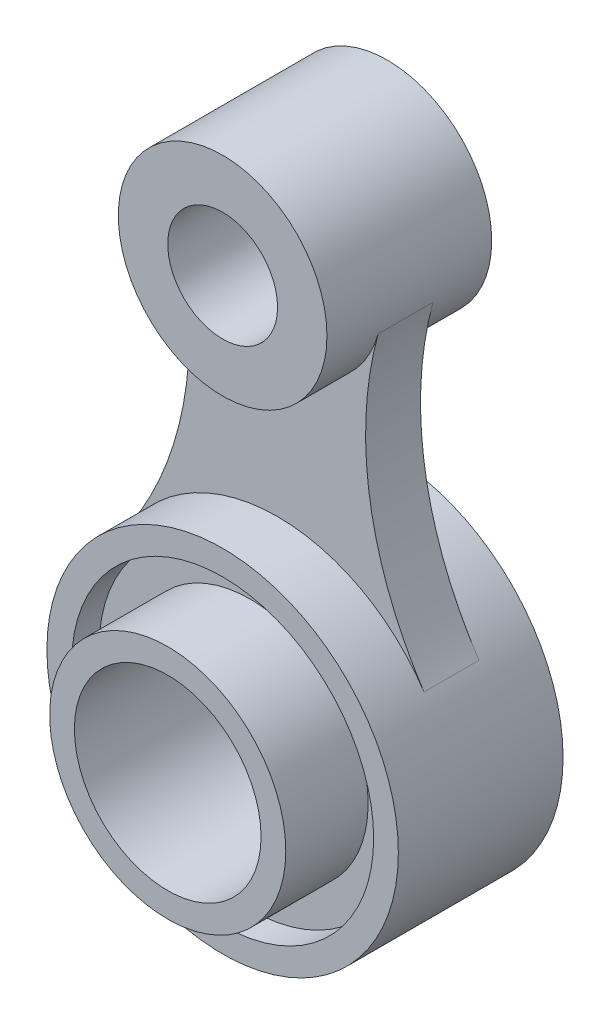
ISO-10303-21;
HEADER;
FILE_DESCRIPTION(('STEP AP214'),'2;1');
FILE_NAME('part.step','',(''),(''),'','','');
FILE_SCHEMA(('AUTOMOTIVE_DESIGN { 1 0 10303 214 1 1 1 1 }'));
ENDSEC;
DATA;
#1=APPLICATION_CONTEXT('core data for automotive mechanical design processes');
#2=APPLICATION_PROTOCOL_DEFINITION('international standard','automotive_design',2000,#1);
#3=PRODUCT_CONTEXT('',#1,'mechanical');
#4=PRODUCT('Part','Part','',(#3));
#5=PRODUCT_RELATED_PRODUCT_CATEGORY('part','',(#4));
#6=PRODUCT_DEFINITION_FORMATION('','',#4);
#7=PRODUCT_DEFINITION_CONTEXT('part definition',#1,'design');
#8=PRODUCT_DEFINITION('design','',#6,#7);
#9=PRODUCT_DEFINITION_SHAPE('','',#8);
#10=(LENGTH_UNIT() NAMED_UNIT(*) SI_UNIT(.MILLI.,.METRE.));
#11=(NAMED_UNIT(*) PLANE_ANGLE_UNIT() SI_UNIT($,.RADIAN.));
#12=(NAMED_UNIT(*) SI_UNIT($,.STERADIAN.) SOLID_ANGLE_UNIT());
#13=UNCERTAINTY_MEASURE_WITH_UNIT(LENGTH_MEASURE(1.E-05),#10,'distance_accuracy_value','');
#14=(GEOMETRIC_REPRESENTATION_CONTEXT(3) GLOBAL_UNCERTAINTY_ASSIGNED_CONTEXT((#13)) GLOBAL_UNIT_ASSIGNED_CONTEXT((#10,
#11,#12)) REPRESENTATION_CONTEXT('',''));
#15=CARTESIAN_POINT('',(0.,0.,0.));
#16=DIRECTION('',(0.,0.,1.));
#17=DIRECTION('',(1.,0.,0.));
#18=AXIS2_PLACEMENT_3D('',#15,#16,#17);
#19=CARTESIAN_POINT('',(0.,0.,30.));
#20=DIRECTION('',(0.,0.,-1.));
#21=DIRECTION('',(-1.,0.,0.));
#22=AXIS2_PLACEMENT_3D('',#19,#20,#21);
#23=CYLINDRICAL_SURFACE('',#22,32.);
#24=CARTESIAN_POINT('',(0.,0.,0.));
#25=DIRECTION('',(0.,0.,1.));
#26=DIRECTION('',(1.,0.,0.));
#27=AXIS2_PLACEMENT_3D('',#24,#25,#26);
#28=CIRCLE('',#27,32.);
#29=CARTESIAN_POINT('',(32.,0.,0.));
#30=VERTEX_POINT('',#29);
#31=EDGE_CURVE('E136',#30,#30,#28,.T.);
#32=ORIENTED_EDGE('',*,*,#31,.T.);
#33=EDGE_LOOP('',(#32));
#34=FACE_BOUND('',#33,.T.);
#35=CARTESIAN_POINT('',(0.,0.,30.));
#36=DIRECTION('',(0.,0.,1.));
#37=DIRECTION('',(1.,0.,0.));
#38=AXIS2_PLACEMENT_3D('',#35,#36,#37);
#39=CIRCLE('',#38,32.);
#40=CARTESIAN_POINT('',(32.,0.,30.));
#41=VERTEX_POINT('',#40);
#42=EDGE_CURVE('E49',#41,#41,#39,.T.);
#43=ORIENTED_EDGE('',*,*,#42,.F.);
#44=EDGE_LOOP('',(#43));
#45=FACE_BOUND('',#44,.T.);
#46=CARTESIAN_POINT('',(0.,0.,10.));
#47=DIRECTION('',(0.,0.,-1.));
#48=DIRECTION('',(1.,0.,0.));
#49=AXIS2_PLACEMENT_3D('',#46,#47,#48);
#50=CIRCLE('',#49,32.);
#51=CARTESIAN_POINT('',(-26.6783026465097,17.6711111111111,10.));
#52=VERTEX_POINT('',#51);
#53=CARTESIAN_POINT('',(26.6783026465097,17.6711111111111,10.));
#54=VERTEX_POINT('',#53);
#55=EDGE_CURVE('E64',#52,#54,#50,.T.);
#56=ORIENTED_EDGE('',*,*,#55,.T.);
#57=DIRECTION('',(0.,0.,1.));
#58=VECTOR('',#57,1.);
#59=CARTESIAN_POINT('',(26.6783026465097,17.6711111111111,10.));
#60=LINE('',#59,#58);
#61=CARTESIAN_POINT('',(26.6783026465097,17.6711111111111,20.));
#62=VERTEX_POINT('',#61);
#63=EDGE_CURVE('E100',#54,#62,#60,.T.);
#64=ORIENTED_EDGE('',*,*,#63,.T.);
#65=CARTESIAN_POINT('',(0.,0.,20.));
#66=DIRECTION('',(0.,0.,-1.));
#67=DIRECTION('',(1.,0.,0.));
#68=AXIS2_PLACEMENT_3D('',#65,#66,#67);
#69=CIRCLE('',#68,32.);
#70=CARTESIAN_POINT('',(-26.6783026465097,17.6711111111111,20.));
#71=VERTEX_POINT('',#70);
#72=EDGE_CURVE('E104',#71,#62,#69,.T.);
#73=ORIENTED_EDGE('',*,*,#72,.F.);
#74=DIRECTION('',(0.,0.,1.));
#75=VECTOR('',#74,1.);
#76=CARTESIAN_POINT('',(-26.6783026465097,17.6711111111111,10.));
#77=LINE('',#76,#75);
#78=EDGE_CURVE('E125',#52,#71,#77,.T.);
#79=ORIENTED_EDGE('',*,*,#78,.F.);
#80=EDGE_LOOP('',(#56,#64,#73,#79));
#81=FACE_BOUND('',#80,.T.);
#82=ADVANCED_FACE('F41',(#34,#45,#81),#23,.T.);
#83=CARTESIAN_POINT('',(0.,0.,30.));
#84=DIRECTION('',(0.,0.,1.));
#85=DIRECTION('',(1.,0.,0.));
#86=AXIS2_PLACEMENT_3D('',#83,#84,#85);
#87=PLANE('',#86);
#88=ORIENTED_EDGE('',*,*,#42,.T.);
#89=EDGE_LOOP('',(#88));
#90=FACE_BOUND('',#89,.T.);
#91=CARTESIAN_POINT('',(0.,0.,30.));
#92=DIRECTION('',(0.,0.,1.));
#93=DIRECTION('',(1.,0.,0.));
#94=AXIS2_PLACEMENT_3D('',#91,#92,#93);
#95=CIRCLE('',#94,27.5);
#96=CARTESIAN_POINT('',(27.5,0.,30.));
#97=VERTEX_POINT('',#96);
#98=EDGE_CURVE('E128',#97,#97,#95,.T.);
#99=ORIENTED_EDGE('',*,*,#98,.F.);
#100=EDGE_LOOP('',(#99));
#101=FACE_BOUND('',#100,.T.);
#102=ADVANCED_FACE('F148',(#90,#101),#87,.T.);
#103=CARTESIAN_POINT('',(0.,0.,0.));
#104=DIRECTION('',(0.,0.,1.));
#105=DIRECTION('',(1.,0.,0.));
#106=AXIS2_PLACEMENT_3D('',#103,#104,#105);
#107=PLANE('',#106);
#108=CARTESIAN_POINT('',(0.,0.,0.));
#109=DIRECTION('',(0.,0.,1.));
#110=DIRECTION('',(1.,0.,0.));
#111=AXIS2_PLACEMENT_3D('',#108,#109,#110);
#112=CIRCLE('',#111,17.);
#113=CARTESIAN_POINT('',(17.,0.,0.));
#114=VERTEX_POINT('',#113);
#115=EDGE_CURVE('E347',#114,#114,#112,.F.);
#116=ORIENTED_EDGE('',*,*,#115,.F.);
#117=EDGE_LOOP('',(#116));
#118=FACE_BOUND('',#117,.T.);
#119=ORIENTED_EDGE('',*,*,#31,.F.);
#120=EDGE_LOOP('',(#119));
#121=FACE_BOUND('',#120,.T.);
#122=ADVANCED_FACE('F145',(#118,#121),#107,.F.);
#123=CARTESIAN_POINT('',(0.,0.,30.));
#124=DIRECTION('',(0.,0.,-1.));
#125=DIRECTION('',(-1.,0.,0.));
#126=AXIS2_PLACEMENT_3D('',#123,#124,#125);
#127=CYLINDRICAL_SURFACE('',#126,27.5);
#128=CARTESIAN_POINT('',(0.,0.,25.));
#129=DIRECTION('',(0.,0.,1.));
#130=DIRECTION('',(1.,0.,0.));
#131=AXIS2_PLACEMENT_3D('',#128,#129,#130);
#132=CIRCLE('',#131,27.5);
#133=CARTESIAN_POINT('',(27.5,0.,25.));
#134=VERTEX_POINT('',#133);
#135=EDGE_CURVE('E11',#134,#134,#132,.T.);
#136=ORIENTED_EDGE('',*,*,#135,.F.);
#137=EDGE_LOOP('',(#136));
#138=FACE_BOUND('',#137,.T.);
#139=ORIENTED_EDGE('',*,*,#98,.T.);
#140=EDGE_LOOP('',(#139));
#141=FACE_BOUND('',#140,.T.);
#142=ADVANCED_FACE('F147',(#138,#141),#127,.F.);
#143=CARTESIAN_POINT('',(-80.034907939529,53.0133333333333,10.));
#144=DIRECTION('',(0.,0.,1.));
#145=DIRECTION('',(1.,0.,0.));
#146=AXIS2_PLACEMENT_3D('',#143,#144,#145);
#147=CYLINDRICAL_SURFACE('',#146,64.);
#148=ORIENTED_EDGE('',*,*,#78,.T.);
#149=CARTESIAN_POINT('',(-80.034907939529,53.0133333333333,20.));
#150=DIRECTION('',(0.,0.,-1.));
#151=DIRECTION('',(1.,0.,0.));
#152=AXIS2_PLACEMENT_3D('',#149,#150,#151);
#153=CIRCLE('',#152,64.);
#154=CARTESIAN_POINT('',(-18.3212439861573,69.9669076305221,20.));
#155=VERTEX_POINT('',#154);
#156=EDGE_CURVE('E56',#155,#71,#153,.T.);
#157=ORIENTED_EDGE('',*,*,#156,.F.);
#158=DIRECTION('',(0.,0.,1.));
#159=VECTOR('',#158,1.);
#160=CARTESIAN_POINT('',(-18.3212439861573,69.9669076305221,10.));
#161=LINE('',#160,#159);
#162=CARTESIAN_POINT('',(-18.3212439861572,69.9669076305221,10.));
#163=VERTEX_POINT('',#162);
#164=EDGE_CURVE('E90',#163,#155,#161,.T.);
#165=ORIENTED_EDGE('',*,*,#164,.F.);
#166=CARTESIAN_POINT('',(-80.034907939529,53.0133333333333,10.));
#167=DIRECTION('',(0.,0.,-1.));
#168=DIRECTION('',(1.,0.,0.));
#169=AXIS2_PLACEMENT_3D('',#166,#167,#168);
#170=CIRCLE('',#169,64.);
#171=EDGE_CURVE('E122',#163,#52,#170,.T.);
#172=ORIENTED_EDGE('',*,*,#171,.T.);
#173=EDGE_LOOP('',(#148,#157,#165,#172));
#174=FACE_BOUND('',#173,.T.);
#175=ADVANCED_FACE('F154',(#174),#147,.F.);
#176=CARTESIAN_POINT('',(80.034907939529,53.0133333333333,10.));
#177=DIRECTION('',(0.,0.,1.));
#178=DIRECTION('',(1.,0.,0.));
#179=AXIS2_PLACEMENT_3D('',#176,#177,#178);
#180=CYLINDRICAL_SURFACE('',#179,64.);
#181=DIRECTION('',(0.,0.,1.));
#182=VECTOR('',#181,1.);
#183=CARTESIAN_POINT('',(18.3212439861572,69.9669076305221,10.));
#184=LINE('',#183,#182);
#185=CARTESIAN_POINT('',(18.3212439861572,69.9669076305221,10.));
#186=VERTEX_POINT('',#185);
#187=CARTESIAN_POINT('',(18.3212439861572,69.9669076305221,20.));
#188=VERTEX_POINT('',#187);
#189=EDGE_CURVE('E87',#186,#188,#184,.T.);
#190=ORIENTED_EDGE('',*,*,#189,.T.);
#191=CARTESIAN_POINT('',(80.034907939529,53.0133333333333,20.));
#192=DIRECTION('',(0.,0.,-1.));
#193=DIRECTION('',(-1.,0.,0.));
#194=AXIS2_PLACEMENT_3D('',#191,#192,#193);
#195=CIRCLE('',#194,64.);
#196=EDGE_CURVE('E93',#62,#188,#195,.T.);
#197=ORIENTED_EDGE('',*,*,#196,.F.);
#198=ORIENTED_EDGE('',*,*,#63,.F.);
#199=CARTESIAN_POINT('',(80.034907939529,53.0133333333333,10.));
#200=DIRECTION('',(0.,0.,-1.));
#201=DIRECTION('',(-1.,0.,0.));
#202=AXIS2_PLACEMENT_3D('',#199,#200,#201);
#203=CIRCLE('',#202,64.);
#204=EDGE_CURVE('E98',#54,#186,#203,.T.);
#205=ORIENTED_EDGE('',*,*,#204,.T.);
#206=EDGE_LOOP('',(#190,#197,#198,#205));
#207=FACE_BOUND('',#206,.T.);
#208=ADVANCED_FACE('F97',(#207),#180,.F.);
#209=CARTESIAN_POINT('',(-40.0174539697645,26.5066666666667,10.));
#210=DIRECTION('',(0.,0.,1.));
#211=DIRECTION('',(1.,0.,0.));
#212=AXIS2_PLACEMENT_3D('',#209,#210,#211);
#213=PLANE('',#212);
#214=ORIENTED_EDGE('',*,*,#55,.F.);
#215=ORIENTED_EDGE('',*,*,#171,.F.);
#216=CARTESIAN_POINT('',(0.,75.,10.));
#217=DIRECTION('',(0.,0.,-1.));
#218=DIRECTION('',(1.,0.,0.));
#219=AXIS2_PLACEMENT_3D('',#216,#217,#218);
#220=CIRCLE('',#219,19.);
#221=EDGE_CURVE('E119',#186,#163,#220,.T.);
#222=ORIENTED_EDGE('',*,*,#221,.F.);
#223=ORIENTED_EDGE('',*,*,#204,.F.);
#224=EDGE_LOOP('',(#214,#215,#222,#223));
#225=FACE_BOUND('',#224,.T.);
#226=ADVANCED_FACE('F288',(#225),#213,.F.);
#227=CARTESIAN_POINT('',(-40.0174539697645,26.5066666666667,20.));
#228=DIRECTION('',(0.,0.,1.));
#229=DIRECTION('',(1.,0.,0.));
#230=AXIS2_PLACEMENT_3D('',#227,#228,#229);
#231=PLANE('',#230);
#232=ORIENTED_EDGE('',*,*,#72,.T.);
#233=ORIENTED_EDGE('',*,*,#196,.T.);
#234=CARTESIAN_POINT('',(0.,75.,20.));
#235=DIRECTION('',(0.,0.,-1.));
#236=DIRECTION('',(1.,0.,0.));
#237=AXIS2_PLACEMENT_3D('',#234,#235,#236);
#238=CIRCLE('',#237,19.);
#239=EDGE_CURVE('E84',#188,#155,#238,.T.);
#240=ORIENTED_EDGE('',*,*,#239,.T.);
#241=ORIENTED_EDGE('',*,*,#156,.T.);
#242=EDGE_LOOP('',(#232,#233,#240,#241));
#243=FACE_BOUND('',#242,.T.);
#244=ADVANCED_FACE('F102',(#243),#231,.T.);
#245=CARTESIAN_POINT('',(0.,75.,0.));
#246=DIRECTION('',(0.,0.,1.));
#247=DIRECTION('',(1.,0.,0.));
#248=AXIS2_PLACEMENT_3D('',#245,#246,#247);
#249=CYLINDRICAL_SURFACE('',#248,19.);
#250=CARTESIAN_POINT('',(0.,75.,30.));
#251=DIRECTION('',(0.,0.,1.));
#252=DIRECTION('',(1.,0.,0.));
#253=AXIS2_PLACEMENT_3D('',#250,#251,#252);
#254=CIRCLE('',#253,19.);
#255=CARTESIAN_POINT('',(19.,75.,30.));
#256=VERTEX_POINT('',#255);
#257=EDGE_CURVE('E332',#256,#256,#254,.T.);
#258=ORIENTED_EDGE('',*,*,#257,.F.);
#259=EDGE_LOOP('',(#258));
#260=FACE_BOUND('',#259,.T.);
#261=CARTESIAN_POINT('',(0.,75.,0.));
#262=DIRECTION('',(0.,0.,1.));
#263=DIRECTION('',(1.,0.,0.));
#264=AXIS2_PLACEMENT_3D('',#261,#262,#263);
#265=CIRCLE('',#264,19.);
#266=CARTESIAN_POINT('',(19.,75.,0.));
#267=VERTEX_POINT('',#266);
#268=EDGE_CURVE('E109',#267,#267,#265,.T.);
#269=ORIENTED_EDGE('',*,*,#268,.T.);
#270=EDGE_LOOP('',(#269));
#271=FACE_BOUND('',#270,.T.);
#272=ORIENTED_EDGE('',*,*,#221,.T.);
#273=ORIENTED_EDGE('',*,*,#164,.T.);
#274=ORIENTED_EDGE('',*,*,#239,.F.);
#275=ORIENTED_EDGE('',*,*,#189,.F.);
#276=EDGE_LOOP('',(#272,#273,#274,#275));
#277=FACE_BOUND('',#276,.T.);
#278=ADVANCED_FACE('F86',(#260,#271,#277),#249,.T.);
#279=CARTESIAN_POINT('',(0.,75.,0.));
#280=DIRECTION('',(0.,0.,1.));
#281=DIRECTION('',(1.,0.,0.));
#282=AXIS2_PLACEMENT_3D('',#279,#280,#281);
#283=PLANE('',#282);
#284=CARTESIAN_POINT('',(0.,75.,0.));
#285=DIRECTION('',(0.,0.,1.));
#286=DIRECTION('',(1.,0.,0.));
#287=AXIS2_PLACEMENT_3D('',#284,#285,#286);
#288=CIRCLE('',#287,10.);
#289=CARTESIAN_POINT('',(10.,75.,0.));
#290=VERTEX_POINT('',#289);
#291=EDGE_CURVE('E326',#290,#290,#288,.T.);
#292=ORIENTED_EDGE('',*,*,#291,.T.);
#293=EDGE_LOOP('',(#292));
#294=FACE_BOUND('',#293,.T.);
#295=ORIENTED_EDGE('',*,*,#268,.F.);
#296=EDGE_LOOP('',(#295));
#297=FACE_BOUND('',#296,.T.);
#298=ADVANCED_FACE('F209',(#294,#297),#283,.F.);
#299=CARTESIAN_POINT('',(0.,75.,0.));
#300=DIRECTION('',(0.,0.,1.));
#301=DIRECTION('',(1.,0.,0.));
#302=AXIS2_PLACEMENT_3D('',#299,#300,#301);
#303=CYLINDRICAL_SURFACE('',#302,10.);
#304=ORIENTED_EDGE('',*,*,#291,.F.);
#305=EDGE_LOOP('',(#304));
#306=FACE_BOUND('',#305,.T.);
#307=CARTESIAN_POINT('',(0.,75.,30.));
#308=DIRECTION('',(0.,0.,1.));
#309=DIRECTION('',(1.,0.,0.));
#310=AXIS2_PLACEMENT_3D('',#307,#308,#309);
#311=CIRCLE('',#310,10.);
#312=CARTESIAN_POINT('',(10.,75.,30.));
#313=VERTEX_POINT('',#312);
#314=EDGE_CURVE('E338',#313,#313,#311,.T.);
#315=ORIENTED_EDGE('',*,*,#314,.T.);
#316=EDGE_LOOP('',(#315));
#317=FACE_BOUND('',#316,.T.);
#318=ADVANCED_FACE('F228',(#306,#317),#303,.F.);
#319=CARTESIAN_POINT('',(0.,75.,30.));
#320=DIRECTION('',(0.,0.,1.));
#321=DIRECTION('',(1.,0.,0.));
#322=AXIS2_PLACEMENT_3D('',#319,#320,#321);
#323=PLANE('',#322);
#324=ORIENTED_EDGE('',*,*,#257,.T.);
#325=EDGE_LOOP('',(#324));
#326=FACE_BOUND('',#325,.T.);
#327=ORIENTED_EDGE('',*,*,#314,.F.);
#328=EDGE_LOOP('',(#327));
#329=FACE_BOUND('',#328,.T.);
#330=ADVANCED_FACE('F232',(#326,#329),#323,.T.);
#331=CARTESIAN_POINT('',(0.,0.,25.));
#332=DIRECTION('',(0.,0.,1.));
#333=DIRECTION('',(1.,0.,0.));
#334=AXIS2_PLACEMENT_3D('',#331,#332,#333);
#335=PLANE('',#334);
#336=CARTESIAN_POINT('',(0.,0.,25.));
#337=DIRECTION('',(0.,0.,1.));
#338=DIRECTION('',(1.,0.,0.));
#339=AXIS2_PLACEMENT_3D('',#336,#337,#338);
#340=CIRCLE('',#339,21.5);
#341=CARTESIAN_POINT('',(21.5,0.,25.));
#342=VERTEX_POINT('',#341);
#343=EDGE_CURVE('E343',#342,#342,#340,.T.);
#344=ORIENTED_EDGE('',*,*,#343,.F.);
#345=EDGE_LOOP('',(#344));
#346=FACE_BOUND('',#345,.T.);
#347=ORIENTED_EDGE('',*,*,#135,.T.);
#348=EDGE_LOOP('',(#347));
#349=FACE_BOUND('',#348,.T.);
#350=ADVANCED_FACE('F197',(#346,#349),#335,.T.);
#351=CARTESIAN_POINT('',(0.,0.,40.));
#352=DIRECTION('',(0.,0.,-1.));
#353=DIRECTION('',(-1.,0.,0.));
#354=AXIS2_PLACEMENT_3D('',#351,#352,#353);
#355=CYLINDRICAL_SURFACE('',#354,21.5);
#356=CARTESIAN_POINT('',(0.,0.,40.));
#357=DIRECTION('',(0.,0.,1.));
#358=DIRECTION('',(1.,0.,0.));
#359=AXIS2_PLACEMENT_3D('',#356,#357,#358);
#360=CIRCLE('',#359,21.5);
#361=CARTESIAN_POINT('',(21.5,0.,40.));
#362=VERTEX_POINT('',#361);
#363=EDGE_CURVE('E342',#362,#362,#360,.T.);
#364=ORIENTED_EDGE('',*,*,#363,.F.);
#365=EDGE_LOOP('',(#364));
#366=FACE_BOUND('',#365,.T.);
#367=ORIENTED_EDGE('',*,*,#343,.T.);
#368=EDGE_LOOP('',(#367));
#369=FACE_BOUND('',#368,.T.);
#370=ADVANCED_FACE('F185',(#366,#369),#355,.T.);
#371=CARTESIAN_POINT('',(0.,0.,40.));
#372=DIRECTION('',(0.,0.,1.));
#373=DIRECTION('',(1.,0.,0.));
#374=AXIS2_PLACEMENT_3D('',#371,#372,#373);
#375=PLANE('',#374);
#376=CARTESIAN_POINT('',(0.,0.,40.));
#377=DIRECTION('',(0.,0.,1.));
#378=DIRECTION('',(1.,0.,0.));
#379=AXIS2_PLACEMENT_3D('',#376,#377,#378);
#380=CIRCLE('',#379,17.);
#381=CARTESIAN_POINT('',(17.,0.,40.));
#382=VERTEX_POINT('',#381);
#383=EDGE_CURVE('E354',#382,#382,#380,.T.);
#384=ORIENTED_EDGE('',*,*,#383,.F.);
#385=EDGE_LOOP('',(#384));
#386=FACE_BOUND('',#385,.T.);
#387=ORIENTED_EDGE('',*,*,#363,.T.);
#388=EDGE_LOOP('',(#387));
#389=FACE_BOUND('',#388,.T.);
#390=ADVANCED_FACE('F179',(#386,#389),#375,.T.);
#391=CARTESIAN_POINT('',(0.,0.,-48.0832611206852));
#392=DIRECTION('',(0.,0.,1.));
#393=DIRECTION('',(1.,0.,0.));
#394=AXIS2_PLACEMENT_3D('',#391,#392,#393);
#395=CYLINDRICAL_SURFACE('',#394,17.);
#396=ORIENTED_EDGE('',*,*,#115,.T.);
#397=EDGE_LOOP('',(#396));
#398=FACE_BOUND('',#397,.T.);
#399=ORIENTED_EDGE('',*,*,#383,.T.);
#400=EDGE_LOOP('',(#399));
#401=FACE_BOUND('',#400,.T.);
#402=ADVANCED_FACE('F184',(#398,#401),#395,.F.);
#403=CLOSED_SHELL('',(#82,#102,#122,#142,#175,#208,#226,#244,#278,#298,#318,#330,#350,#370,#390,#402));
#404=MANIFOLD_SOLID_BREP('B2',#403);
#405=ADVANCED_BREP_SHAPE_REPRESENTATION('',(#18,#404),#14);
#406=SHAPE_DEFINITION_REPRESENTATION(#9,#405);
ENDSEC;
END-ISO-10303-21;
